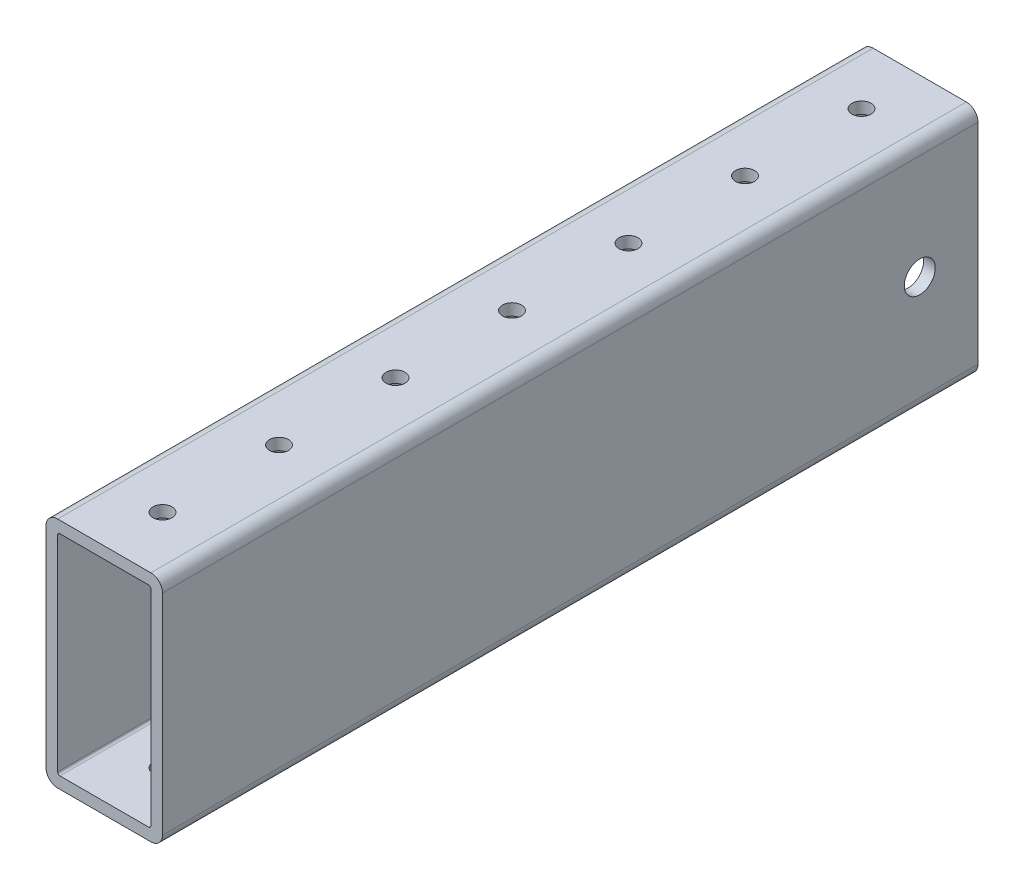
ISO-10303-21;
HEADER;
FILE_DESCRIPTION(('STEP AP214'),'2;1');
FILE_NAME('part.step','',(''),(''),'','','');
FILE_SCHEMA(('AUTOMOTIVE_DESIGN { 1 0 10303 214 1 1 1 1 }'));
ENDSEC;
DATA;
#1=APPLICATION_CONTEXT('core data for automotive mechanical design processes');
#2=APPLICATION_PROTOCOL_DEFINITION('international standard','automotive_design',2000,#1);
#3=PRODUCT_CONTEXT('',#1,'mechanical');
#4=PRODUCT('Part','Part','',(#3));
#5=PRODUCT_RELATED_PRODUCT_CATEGORY('part','',(#4));
#6=PRODUCT_DEFINITION_FORMATION('','',#4);
#7=PRODUCT_DEFINITION_CONTEXT('part definition',#1,'design');
#8=PRODUCT_DEFINITION('design','',#6,#7);
#9=PRODUCT_DEFINITION_SHAPE('','',#8);
#10=(LENGTH_UNIT() NAMED_UNIT(*) SI_UNIT(.MILLI.,.METRE.));
#11=(NAMED_UNIT(*) PLANE_ANGLE_UNIT() SI_UNIT($,.RADIAN.));
#12=(NAMED_UNIT(*) SI_UNIT($,.STERADIAN.) SOLID_ANGLE_UNIT());
#13=UNCERTAINTY_MEASURE_WITH_UNIT(LENGTH_MEASURE(1.E-05),#10,'distance_accuracy_value','');
#14=(GEOMETRIC_REPRESENTATION_CONTEXT(3) GLOBAL_UNCERTAINTY_ASSIGNED_CONTEXT((#13)) GLOBAL_UNIT_ASSIGNED_CONTEXT((#10,
#11,#12)) REPRESENTATION_CONTEXT('',''));
#15=CARTESIAN_POINT('',(0.,0.,0.));
#16=DIRECTION('',(0.,0.,1.));
#17=DIRECTION('',(1.,0.,0.));
#18=AXIS2_PLACEMENT_3D('',#15,#16,#17);
#19=CARTESIAN_POINT('',(-9.66000000000006,22.36,749.3));
#20=DIRECTION('',(0.,0.,1.));
#21=DIRECTION('',(1.,0.,0.));
#22=AXIS2_PLACEMENT_3D('',#19,#20,#21);
#23=CYLINDRICAL_SURFACE('',#22,0.5);
#24=DIRECTION('',(0.,0.,-1.));
#25=VECTOR('',#24,1.);
#26=CARTESIAN_POINT('',(-10.1600000000001,22.36,749.3));
#27=LINE('',#26,#25);
#28=CARTESIAN_POINT('',(-10.1600000000001,22.36,571.5));
#29=VERTEX_POINT('',#28);
#30=CARTESIAN_POINT('',(-10.1600000000001,22.36,749.3));
#31=VERTEX_POINT('',#30);
#32=EDGE_CURVE('E203',#29,#31,#27,.F.);
#33=ORIENTED_EDGE('',*,*,#32,.F.);
#34=CARTESIAN_POINT('',(-9.66000000000005,22.36,571.5));
#35=DIRECTION('',(0.,0.,1.));
#36=DIRECTION('',(1.,0.,0.));
#37=AXIS2_PLACEMENT_3D('',#34,#35,#36);
#38=CIRCLE('',#37,0.5);
#39=CARTESIAN_POINT('',(-9.66000000000006,22.86,571.5));
#40=VERTEX_POINT('',#39);
#41=EDGE_CURVE('E339',#29,#40,#38,.F.);
#42=ORIENTED_EDGE('',*,*,#41,.T.);
#43=DIRECTION('',(0.,0.,-1.));
#44=VECTOR('',#43,1.);
#45=CARTESIAN_POINT('',(-9.66000000000006,22.86,749.3));
#46=LINE('',#45,#44);
#47=CARTESIAN_POINT('',(-9.66000000000006,22.86,749.3));
#48=VERTEX_POINT('',#47);
#49=EDGE_CURVE('E279',#48,#40,#46,.T.);
#50=ORIENTED_EDGE('',*,*,#49,.F.);
#51=CARTESIAN_POINT('',(-9.66000000000006,22.36,749.3));
#52=DIRECTION('',(0.,0.,1.));
#53=DIRECTION('',(1.,0.,0.));
#54=AXIS2_PLACEMENT_3D('',#51,#52,#53);
#55=CIRCLE('',#54,0.5);
#56=EDGE_CURVE('E333',#31,#48,#55,.F.);
#57=ORIENTED_EDGE('',*,*,#56,.F.);
#58=EDGE_LOOP('',(#33,#42,#50,#57));
#59=FACE_BOUND('',#58,.T.);
#60=ADVANCED_FACE('F35',(#59),#23,.F.);
#61=CARTESIAN_POINT('',(0.,-25.4,584.2));
#62=DIRECTION('',(0.,1.,0.));
#63=DIRECTION('',(-1.,0.,0.));
#64=AXIS2_PLACEMENT_3D('',#61,#62,#63);
#65=CYLINDRICAL_SURFACE('',#64,2.07009999999996);
#66=CARTESIAN_POINT('',(0.,22.86,584.2));
#67=DIRECTION('',(0.,1.,0.));
#68=DIRECTION('',(-1.,0.,0.));
#69=AXIS2_PLACEMENT_3D('',#66,#67,#68);
#70=CIRCLE('',#69,2.07009999999996);
#71=CARTESIAN_POINT('',(-2.07009999999999,22.86,584.2));
#72=VERTEX_POINT('',#71);
#73=EDGE_CURVE('E276',#72,#72,#70,.T.);
#74=ORIENTED_EDGE('',*,*,#73,.F.);
#75=EDGE_LOOP('',(#74));
#76=FACE_BOUND('',#75,.T.);
#77=CARTESIAN_POINT('',(0.,25.4,584.2));
#78=DIRECTION('',(0.,1.,0.));
#79=DIRECTION('',(-1.,0.,0.));
#80=AXIS2_PLACEMENT_3D('',#77,#78,#79);
#81=CIRCLE('',#80,2.07009999999996);
#82=CARTESIAN_POINT('',(-2.07009999999999,25.4,584.2));
#83=VERTEX_POINT('',#82);
#84=EDGE_CURVE('E324',#83,#83,#81,.T.);
#85=ORIENTED_EDGE('',*,*,#84,.T.);
#86=EDGE_LOOP('',(#85));
#87=FACE_BOUND('',#86,.T.);
#88=ADVANCED_FACE('F522',(#76,#87),#65,.F.);
#89=CARTESIAN_POINT('',(0.,-25.4,609.6));
#90=DIRECTION('',(0.,1.,0.));
#91=DIRECTION('',(-1.,0.,0.));
#92=AXIS2_PLACEMENT_3D('',#89,#90,#91);
#93=CYLINDRICAL_SURFACE('',#92,2.07009999999996);
#94=CARTESIAN_POINT('',(0.,22.86,609.6));
#95=DIRECTION('',(0.,1.,0.));
#96=DIRECTION('',(-1.,0.,0.));
#97=AXIS2_PLACEMENT_3D('',#94,#95,#96);
#98=CIRCLE('',#97,2.07009999999996);
#99=CARTESIAN_POINT('',(-2.07009999999996,22.86,609.6));
#100=VERTEX_POINT('',#99);
#101=EDGE_CURVE('E273',#100,#100,#98,.T.);
#102=ORIENTED_EDGE('',*,*,#101,.F.);
#103=EDGE_LOOP('',(#102));
#104=FACE_BOUND('',#103,.T.);
#105=CARTESIAN_POINT('',(0.,25.4,609.6));
#106=DIRECTION('',(0.,1.,0.));
#107=DIRECTION('',(-1.,0.,0.));
#108=AXIS2_PLACEMENT_3D('',#105,#106,#107);
#109=CIRCLE('',#108,2.07009999999996);
#110=CARTESIAN_POINT('',(-2.07009999999996,25.4,609.6));
#111=VERTEX_POINT('',#110);
#112=EDGE_CURVE('E320',#111,#111,#109,.T.);
#113=ORIENTED_EDGE('',*,*,#112,.T.);
#114=EDGE_LOOP('',(#113));
#115=FACE_BOUND('',#114,.T.);
#116=ADVANCED_FACE('F519',(#104,#115),#93,.F.);
#117=CARTESIAN_POINT('',(0.,-25.4,635.));
#118=DIRECTION('',(0.,1.,0.));
#119=DIRECTION('',(-1.,0.,0.));
#120=AXIS2_PLACEMENT_3D('',#117,#118,#119);
#121=CYLINDRICAL_SURFACE('',#120,2.07009999999996);
#122=CARTESIAN_POINT('',(0.,22.8599999999999,635.));
#123=DIRECTION('',(0.,1.,0.));
#124=DIRECTION('',(-1.,0.,0.));
#125=AXIS2_PLACEMENT_3D('',#122,#123,#124);
#126=CIRCLE('',#125,2.07009999999996);
#127=CARTESIAN_POINT('',(-2.07009999999996,22.8599999999999,635.));
#128=VERTEX_POINT('',#127);
#129=EDGE_CURVE('E270',#128,#128,#126,.T.);
#130=ORIENTED_EDGE('',*,*,#129,.F.);
#131=EDGE_LOOP('',(#130));
#132=FACE_BOUND('',#131,.T.);
#133=CARTESIAN_POINT('',(0.,25.4,635.));
#134=DIRECTION('',(0.,1.,0.));
#135=DIRECTION('',(-1.,0.,0.));
#136=AXIS2_PLACEMENT_3D('',#133,#134,#135);
#137=CIRCLE('',#136,2.07009999999996);
#138=CARTESIAN_POINT('',(-2.07009999999996,25.4,635.));
#139=VERTEX_POINT('',#138);
#140=EDGE_CURVE('E317',#139,#139,#137,.T.);
#141=ORIENTED_EDGE('',*,*,#140,.T.);
#142=EDGE_LOOP('',(#141));
#143=FACE_BOUND('',#142,.T.);
#144=ADVANCED_FACE('F515',(#132,#143),#121,.F.);
#145=CARTESIAN_POINT('',(0.,-25.4,660.4));
#146=DIRECTION('',(0.,1.,0.));
#147=DIRECTION('',(-1.,0.,0.));
#148=AXIS2_PLACEMENT_3D('',#145,#146,#147);
#149=CYLINDRICAL_SURFACE('',#148,2.07009999999996);
#150=CARTESIAN_POINT('',(0.,22.86,660.4));
#151=DIRECTION('',(0.,1.,0.));
#152=DIRECTION('',(-1.,0.,0.));
#153=AXIS2_PLACEMENT_3D('',#150,#151,#152);
#154=CIRCLE('',#153,2.07009999999996);
#155=CARTESIAN_POINT('',(-2.07009999999996,22.86,660.4));
#156=VERTEX_POINT('',#155);
#157=EDGE_CURVE('E267',#156,#156,#154,.T.);
#158=ORIENTED_EDGE('',*,*,#157,.F.);
#159=EDGE_LOOP('',(#158));
#160=FACE_BOUND('',#159,.T.);
#161=CARTESIAN_POINT('',(0.,25.3999999999999,660.4));
#162=DIRECTION('',(0.,1.,0.));
#163=DIRECTION('',(-1.,0.,0.));
#164=AXIS2_PLACEMENT_3D('',#161,#162,#163);
#165=CIRCLE('',#164,2.07009999999996);
#166=CARTESIAN_POINT('',(-2.07009999999996,25.3999999999999,660.4));
#167=VERTEX_POINT('',#166);
#168=EDGE_CURVE('E314',#167,#167,#165,.T.);
#169=ORIENTED_EDGE('',*,*,#168,.T.);
#170=EDGE_LOOP('',(#169));
#171=FACE_BOUND('',#170,.T.);
#172=ADVANCED_FACE('F511',(#160,#171),#149,.F.);
#173=CARTESIAN_POINT('',(0.,-25.4,685.8));
#174=DIRECTION('',(0.,1.,0.));
#175=DIRECTION('',(-1.,0.,0.));
#176=AXIS2_PLACEMENT_3D('',#173,#174,#175);
#177=CYLINDRICAL_SURFACE('',#176,2.07009999999996);
#178=CARTESIAN_POINT('',(0.,22.86,685.8));
#179=DIRECTION('',(0.,1.,0.));
#180=DIRECTION('',(-1.,0.,0.));
#181=AXIS2_PLACEMENT_3D('',#178,#179,#180);
#182=CIRCLE('',#181,2.07009999999996);
#183=CARTESIAN_POINT('',(-2.07009999999999,22.86,685.8));
#184=VERTEX_POINT('',#183);
#185=EDGE_CURVE('E263',#184,#184,#182,.T.);
#186=ORIENTED_EDGE('',*,*,#185,.F.);
#187=EDGE_LOOP('',(#186));
#188=FACE_BOUND('',#187,.T.);
#189=CARTESIAN_POINT('',(0.,25.4,685.8));
#190=DIRECTION('',(0.,1.,0.));
#191=DIRECTION('',(-1.,0.,0.));
#192=AXIS2_PLACEMENT_3D('',#189,#190,#191);
#193=CIRCLE('',#192,2.07009999999996);
#194=CARTESIAN_POINT('',(-2.07009999999999,25.4,685.8));
#195=VERTEX_POINT('',#194);
#196=EDGE_CURVE('E311',#195,#195,#193,.T.);
#197=ORIENTED_EDGE('',*,*,#196,.T.);
#198=EDGE_LOOP('',(#197));
#199=FACE_BOUND('',#198,.T.);
#200=ADVANCED_FACE('F507',(#188,#199),#177,.F.);
#201=CARTESIAN_POINT('',(0.,-25.4,711.2));
#202=DIRECTION('',(0.,1.,0.));
#203=DIRECTION('',(-1.,0.,0.));
#204=AXIS2_PLACEMENT_3D('',#201,#202,#203);
#205=CYLINDRICAL_SURFACE('',#204,2.07009999999996);
#206=CARTESIAN_POINT('',(0.,22.86,711.2));
#207=DIRECTION('',(0.,1.,0.));
#208=DIRECTION('',(-1.,0.,0.));
#209=AXIS2_PLACEMENT_3D('',#206,#207,#208);
#210=CIRCLE('',#209,2.07009999999996);
#211=CARTESIAN_POINT('',(-2.07009999999996,22.86,711.2));
#212=VERTEX_POINT('',#211);
#213=EDGE_CURVE('E260',#212,#212,#210,.T.);
#214=ORIENTED_EDGE('',*,*,#213,.F.);
#215=EDGE_LOOP('',(#214));
#216=FACE_BOUND('',#215,.T.);
#217=CARTESIAN_POINT('',(0.,25.4,711.2));
#218=DIRECTION('',(0.,1.,0.));
#219=DIRECTION('',(-1.,0.,0.));
#220=AXIS2_PLACEMENT_3D('',#217,#218,#219);
#221=CIRCLE('',#220,2.07009999999996);
#222=CARTESIAN_POINT('',(-2.07009999999996,25.4,711.2));
#223=VERTEX_POINT('',#222);
#224=EDGE_CURVE('E308',#223,#223,#221,.T.);
#225=ORIENTED_EDGE('',*,*,#224,.T.);
#226=EDGE_LOOP('',(#225));
#227=FACE_BOUND('',#226,.T.);
#228=ADVANCED_FACE('F503',(#216,#227),#205,.F.);
#229=CARTESIAN_POINT('',(0.,-25.4,736.6));
#230=DIRECTION('',(0.,1.,0.));
#231=DIRECTION('',(-1.,0.,0.));
#232=AXIS2_PLACEMENT_3D('',#229,#230,#231);
#233=CYLINDRICAL_SURFACE('',#232,2.07009999999996);
#234=CARTESIAN_POINT('',(0.,22.86,736.6));
#235=DIRECTION('',(0.,1.,0.));
#236=DIRECTION('',(-1.,0.,0.));
#237=AXIS2_PLACEMENT_3D('',#234,#235,#236);
#238=CIRCLE('',#237,2.07009999999996);
#239=CARTESIAN_POINT('',(-2.07009999999993,22.86,736.6));
#240=VERTEX_POINT('',#239);
#241=EDGE_CURVE('E197',#240,#240,#238,.T.);
#242=ORIENTED_EDGE('',*,*,#241,.F.);
#243=EDGE_LOOP('',(#242));
#244=FACE_BOUND('',#243,.T.);
#245=CARTESIAN_POINT('',(0.,25.4,736.6));
#246=DIRECTION('',(0.,1.,0.));
#247=DIRECTION('',(-1.,0.,0.));
#248=AXIS2_PLACEMENT_3D('',#245,#246,#247);
#249=CIRCLE('',#248,2.07009999999996);
#250=CARTESIAN_POINT('',(-2.07009999999993,25.4,736.6));
#251=VERTEX_POINT('',#250);
#252=EDGE_CURVE('E305',#251,#251,#249,.T.);
#253=ORIENTED_EDGE('',*,*,#252,.T.);
#254=EDGE_LOOP('',(#253));
#255=FACE_BOUND('',#254,.T.);
#256=ADVANCED_FACE('F499',(#244,#255),#233,.F.);
#257=CARTESIAN_POINT('',(9.66,22.36,749.3));
#258=DIRECTION('',(0.,0.,1.));
#259=DIRECTION('',(1.,0.,0.));
#260=AXIS2_PLACEMENT_3D('',#257,#258,#259);
#261=CYLINDRICAL_SURFACE('',#260,0.5);
#262=DIRECTION('',(0.,0.,-1.));
#263=VECTOR('',#262,1.);
#264=CARTESIAN_POINT('',(9.66,22.86,749.3));
#265=LINE('',#264,#263);
#266=CARTESIAN_POINT('',(9.66,22.86,571.5));
#267=VERTEX_POINT('',#266);
#268=CARTESIAN_POINT('',(9.66,22.86,749.3));
#269=VERTEX_POINT('',#268);
#270=EDGE_CURVE('E202',#267,#269,#265,.F.);
#271=ORIENTED_EDGE('',*,*,#270,.F.);
#272=CARTESIAN_POINT('',(9.66000000000001,22.36,571.5));
#273=DIRECTION('',(0.,0.,1.));
#274=DIRECTION('',(1.,0.,0.));
#275=AXIS2_PLACEMENT_3D('',#272,#273,#274);
#276=CIRCLE('',#275,0.5);
#277=CARTESIAN_POINT('',(10.16,22.36,571.5));
#278=VERTEX_POINT('',#277);
#279=EDGE_CURVE('E343',#267,#278,#276,.F.);
#280=ORIENTED_EDGE('',*,*,#279,.T.);
#281=DIRECTION('',(0.,0.,1.));
#282=VECTOR('',#281,1.);
#283=CARTESIAN_POINT('',(10.16,22.36,749.3));
#284=LINE('',#283,#282);
#285=CARTESIAN_POINT('',(10.16,22.36,749.3));
#286=VERTEX_POINT('',#285);
#287=EDGE_CURVE('E193',#286,#278,#284,.F.);
#288=ORIENTED_EDGE('',*,*,#287,.F.);
#289=CARTESIAN_POINT('',(9.66,22.36,749.3));
#290=DIRECTION('',(0.,0.,1.));
#291=DIRECTION('',(1.,0.,0.));
#292=AXIS2_PLACEMENT_3D('',#289,#290,#291);
#293=CIRCLE('',#292,0.5);
#294=EDGE_CURVE('E332',#269,#286,#293,.F.);
#295=ORIENTED_EDGE('',*,*,#294,.F.);
#296=EDGE_LOOP('',(#271,#280,#288,#295));
#297=FACE_BOUND('',#296,.T.);
#298=ADVANCED_FACE('F496',(#297),#261,.F.);
#299=CARTESIAN_POINT('',(-9.66,-22.36,749.3));
#300=DIRECTION('',(0.,0.,1.));
#301=DIRECTION('',(1.,0.,0.));
#302=AXIS2_PLACEMENT_3D('',#299,#300,#301);
#303=CYLINDRICAL_SURFACE('',#302,0.5);
#304=DIRECTION('',(0.,0.,1.));
#305=VECTOR('',#304,1.);
#306=CARTESIAN_POINT('',(-9.66,-22.86,749.3));
#307=LINE('',#306,#305);
#308=CARTESIAN_POINT('',(-9.66,-22.86,571.5));
#309=VERTEX_POINT('',#308);
#310=CARTESIAN_POINT('',(-9.66,-22.86,749.3));
#311=VERTEX_POINT('',#310);
#312=EDGE_CURVE('E199',#309,#311,#307,.T.);
#313=ORIENTED_EDGE('',*,*,#312,.F.);
#314=CARTESIAN_POINT('',(-9.65999999999999,-22.36,571.5));
#315=DIRECTION('',(0.,0.,1.));
#316=DIRECTION('',(1.,0.,0.));
#317=AXIS2_PLACEMENT_3D('',#314,#315,#316);
#318=CIRCLE('',#317,0.5);
#319=CARTESIAN_POINT('',(-10.1600000000001,-22.36,571.5));
#320=VERTEX_POINT('',#319);
#321=EDGE_CURVE('E57',#309,#320,#318,.F.);
#322=ORIENTED_EDGE('',*,*,#321,.T.);
#323=DIRECTION('',(0.,0.,-1.));
#324=VECTOR('',#323,1.);
#325=CARTESIAN_POINT('',(-10.1600000000001,-22.36,749.3));
#326=LINE('',#325,#324);
#327=CARTESIAN_POINT('',(-10.1600000000001,-22.36,749.3));
#328=VERTEX_POINT('',#327);
#329=EDGE_CURVE('E200',#328,#320,#326,.T.);
#330=ORIENTED_EDGE('',*,*,#329,.F.);
#331=CARTESIAN_POINT('',(-9.66,-22.36,749.3));
#332=DIRECTION('',(0.,0.,1.));
#333=DIRECTION('',(1.,0.,0.));
#334=AXIS2_PLACEMENT_3D('',#331,#332,#333);
#335=CIRCLE('',#334,0.5);
#336=EDGE_CURVE('E330',#311,#328,#335,.F.);
#337=ORIENTED_EDGE('',*,*,#336,.F.);
#338=EDGE_LOOP('',(#313,#322,#330,#337));
#339=FACE_BOUND('',#338,.T.);
#340=ADVANCED_FACE('F488',(#339),#303,.F.);
#341=CARTESIAN_POINT('',(9.66,-22.36,749.3));
#342=DIRECTION('',(0.,0.,1.));
#343=DIRECTION('',(1.,0.,0.));
#344=AXIS2_PLACEMENT_3D('',#341,#342,#343);
#345=CYLINDRICAL_SURFACE('',#344,0.5);
#346=DIRECTION('',(0.,0.,1.));
#347=VECTOR('',#346,1.);
#348=CARTESIAN_POINT('',(10.16,-22.36,749.3));
#349=LINE('',#348,#347);
#350=CARTESIAN_POINT('',(10.16,-22.36,571.5));
#351=VERTEX_POINT('',#350);
#352=CARTESIAN_POINT('',(10.16,-22.36,749.3));
#353=VERTEX_POINT('',#352);
#354=EDGE_CURVE('E196',#351,#353,#349,.T.);
#355=ORIENTED_EDGE('',*,*,#354,.F.);
#356=CARTESIAN_POINT('',(9.66000000000001,-22.36,571.5));
#357=DIRECTION('',(0.,0.,1.));
#358=DIRECTION('',(1.,0.,0.));
#359=AXIS2_PLACEMENT_3D('',#356,#357,#358);
#360=CIRCLE('',#359,0.5);
#361=CARTESIAN_POINT('',(9.66000000000004,-22.86,571.5));
#362=VERTEX_POINT('',#361);
#363=EDGE_CURVE('E352',#351,#362,#360,.F.);
#364=ORIENTED_EDGE('',*,*,#363,.T.);
#365=DIRECTION('',(0.,0.,1.));
#366=VECTOR('',#365,1.);
#367=CARTESIAN_POINT('',(9.66,-22.86,749.3));
#368=LINE('',#367,#366);
#369=CARTESIAN_POINT('',(9.66,-22.86,749.3));
#370=VERTEX_POINT('',#369);
#371=EDGE_CURVE('E255',#370,#362,#368,.F.);
#372=ORIENTED_EDGE('',*,*,#371,.F.);
#373=CARTESIAN_POINT('',(9.66,-22.36,749.3));
#374=DIRECTION('',(0.,0.,1.));
#375=DIRECTION('',(1.,0.,0.));
#376=AXIS2_PLACEMENT_3D('',#373,#374,#375);
#377=CIRCLE('',#376,0.5);
#378=EDGE_CURVE('E214',#353,#370,#377,.F.);
#379=ORIENTED_EDGE('',*,*,#378,.F.);
#380=EDGE_LOOP('',(#355,#364,#372,#379));
#381=FACE_BOUND('',#380,.T.);
#382=ADVANCED_FACE('F478',(#381),#345,.F.);
#383=CARTESIAN_POINT('',(0.,-25.4,584.2));
#384=DIRECTION('',(0.,1.,0.));
#385=DIRECTION('',(-1.,0.,0.));
#386=AXIS2_PLACEMENT_3D('',#383,#384,#385);
#387=CYLINDRICAL_SURFACE('',#386,2.07009999999996);
#388=CARTESIAN_POINT('',(0.,-22.86,584.2));
#389=DIRECTION('',(0.,1.,0.));
#390=DIRECTION('',(-1.,0.,0.));
#391=AXIS2_PLACEMENT_3D('',#388,#389,#390);
#392=CIRCLE('',#391,2.07009999999996);
#393=CARTESIAN_POINT('',(-2.07009999999999,-22.86,584.2));
#394=VERTEX_POINT('',#393);
#395=EDGE_CURVE('E252',#394,#394,#392,.F.);
#396=ORIENTED_EDGE('',*,*,#395,.F.);
#397=EDGE_LOOP('',(#396));
#398=FACE_BOUND('',#397,.T.);
#399=CARTESIAN_POINT('',(0.,-25.4,584.2));
#400=DIRECTION('',(0.,1.,0.));
#401=DIRECTION('',(-1.,0.,0.));
#402=AXIS2_PLACEMENT_3D('',#399,#400,#401);
#403=CIRCLE('',#402,2.07009999999996);
#404=CARTESIAN_POINT('',(-2.07009999999999,-25.4,584.2));
#405=VERTEX_POINT('',#404);
#406=EDGE_CURVE('E302',#405,#405,#403,.F.);
#407=ORIENTED_EDGE('',*,*,#406,.T.);
#408=EDGE_LOOP('',(#407));
#409=FACE_BOUND('',#408,.T.);
#410=ADVANCED_FACE('F475',(#398,#409),#387,.F.);
#411=CARTESIAN_POINT('',(0.,-25.4,609.6));
#412=DIRECTION('',(0.,1.,0.));
#413=DIRECTION('',(-1.,0.,0.));
#414=AXIS2_PLACEMENT_3D('',#411,#412,#413);
#415=CYLINDRICAL_SURFACE('',#414,2.07009999999996);
#416=CARTESIAN_POINT('',(0.,-22.86,609.6));
#417=DIRECTION('',(0.,1.,0.));
#418=DIRECTION('',(-1.,0.,0.));
#419=AXIS2_PLACEMENT_3D('',#416,#417,#418);
#420=CIRCLE('',#419,2.07009999999996);
#421=CARTESIAN_POINT('',(-2.07009999999996,-22.86,609.6));
#422=VERTEX_POINT('',#421);
#423=EDGE_CURVE('E249',#422,#422,#420,.F.);
#424=ORIENTED_EDGE('',*,*,#423,.F.);
#425=EDGE_LOOP('',(#424));
#426=FACE_BOUND('',#425,.T.);
#427=CARTESIAN_POINT('',(0.,-25.4,609.6));
#428=DIRECTION('',(0.,1.,0.));
#429=DIRECTION('',(-1.,0.,0.));
#430=AXIS2_PLACEMENT_3D('',#427,#428,#429);
#431=CIRCLE('',#430,2.07009999999996);
#432=CARTESIAN_POINT('',(-2.07009999999996,-25.4,609.6));
#433=VERTEX_POINT('',#432);
#434=EDGE_CURVE('E299',#433,#433,#431,.F.);
#435=ORIENTED_EDGE('',*,*,#434,.T.);
#436=EDGE_LOOP('',(#435));
#437=FACE_BOUND('',#436,.T.);
#438=ADVANCED_FACE('F477',(#426,#437),#415,.F.);
#439=CARTESIAN_POINT('',(0.,-25.4,635.));
#440=DIRECTION('',(0.,1.,0.));
#441=DIRECTION('',(-1.,0.,0.));
#442=AXIS2_PLACEMENT_3D('',#439,#440,#441);
#443=CYLINDRICAL_SURFACE('',#442,2.07009999999996);
#444=CARTESIAN_POINT('',(0.,-22.86,635.));
#445=DIRECTION('',(0.,1.,0.));
#446=DIRECTION('',(-1.,0.,0.));
#447=AXIS2_PLACEMENT_3D('',#444,#445,#446);
#448=CIRCLE('',#447,2.07009999999996);
#449=CARTESIAN_POINT('',(-2.07009999999996,-22.86,635.));
#450=VERTEX_POINT('',#449);
#451=EDGE_CURVE('E246',#450,#450,#448,.F.);
#452=ORIENTED_EDGE('',*,*,#451,.F.);
#453=EDGE_LOOP('',(#452));
#454=FACE_BOUND('',#453,.T.);
#455=CARTESIAN_POINT('',(0.,-25.4,635.));
#456=DIRECTION('',(0.,1.,0.));
#457=DIRECTION('',(-1.,0.,0.));
#458=AXIS2_PLACEMENT_3D('',#455,#456,#457);
#459=CIRCLE('',#458,2.07009999999996);
#460=CARTESIAN_POINT('',(-2.07009999999996,-25.4,635.));
#461=VERTEX_POINT('',#460);
#462=EDGE_CURVE('E296',#461,#461,#459,.F.);
#463=ORIENTED_EDGE('',*,*,#462,.T.);
#464=EDGE_LOOP('',(#463));
#465=FACE_BOUND('',#464,.T.);
#466=ADVANCED_FACE('F485',(#454,#465),#443,.F.);
#467=CARTESIAN_POINT('',(0.,-25.4,660.4));
#468=DIRECTION('',(0.,1.,0.));
#469=DIRECTION('',(-1.,0.,0.));
#470=AXIS2_PLACEMENT_3D('',#467,#468,#469);
#471=CYLINDRICAL_SURFACE('',#470,2.07009999999996);
#472=CARTESIAN_POINT('',(0.,-22.86,660.4));
#473=DIRECTION('',(0.,1.,0.));
#474=DIRECTION('',(-1.,0.,0.));
#475=AXIS2_PLACEMENT_3D('',#472,#473,#474);
#476=CIRCLE('',#475,2.07009999999996);
#477=CARTESIAN_POINT('',(-2.07009999999996,-22.86,660.4));
#478=VERTEX_POINT('',#477);
#479=EDGE_CURVE('E243',#478,#478,#476,.F.);
#480=ORIENTED_EDGE('',*,*,#479,.F.);
#481=EDGE_LOOP('',(#480));
#482=FACE_BOUND('',#481,.T.);
#483=CARTESIAN_POINT('',(0.,-25.4,660.4));
#484=DIRECTION('',(0.,1.,0.));
#485=DIRECTION('',(-1.,0.,0.));
#486=AXIS2_PLACEMENT_3D('',#483,#484,#485);
#487=CIRCLE('',#486,2.07009999999996);
#488=CARTESIAN_POINT('',(-2.07009999999996,-25.4,660.4));
#489=VERTEX_POINT('',#488);
#490=EDGE_CURVE('E293',#489,#489,#487,.F.);
#491=ORIENTED_EDGE('',*,*,#490,.T.);
#492=EDGE_LOOP('',(#491));
#493=FACE_BOUND('',#492,.T.);
#494=ADVANCED_FACE('F596',(#482,#493),#471,.F.);
#495=CARTESIAN_POINT('',(0.,-25.4,685.8));
#496=DIRECTION('',(0.,1.,0.));
#497=DIRECTION('',(-1.,0.,0.));
#498=AXIS2_PLACEMENT_3D('',#495,#496,#497);
#499=CYLINDRICAL_SURFACE('',#498,2.07009999999996);
#500=CARTESIAN_POINT('',(0.,-22.86,685.8));
#501=DIRECTION('',(0.,1.,0.));
#502=DIRECTION('',(-1.,0.,0.));
#503=AXIS2_PLACEMENT_3D('',#500,#501,#502);
#504=CIRCLE('',#503,2.07009999999996);
#505=CARTESIAN_POINT('',(-2.07009999999999,-22.86,685.8));
#506=VERTEX_POINT('',#505);
#507=EDGE_CURVE('E240',#506,#506,#504,.F.);
#508=ORIENTED_EDGE('',*,*,#507,.F.);
#509=EDGE_LOOP('',(#508));
#510=FACE_BOUND('',#509,.T.);
#511=CARTESIAN_POINT('',(0.,-25.4,685.8));
#512=DIRECTION('',(0.,1.,0.));
#513=DIRECTION('',(-1.,0.,0.));
#514=AXIS2_PLACEMENT_3D('',#511,#512,#513);
#515=CIRCLE('',#514,2.07009999999996);
#516=CARTESIAN_POINT('',(-2.07009999999999,-25.4,685.8));
#517=VERTEX_POINT('',#516);
#518=EDGE_CURVE('E290',#517,#517,#515,.F.);
#519=ORIENTED_EDGE('',*,*,#518,.T.);
#520=EDGE_LOOP('',(#519));
#521=FACE_BOUND('',#520,.T.);
#522=ADVANCED_FACE('F600',(#510,#521),#499,.F.);
#523=CARTESIAN_POINT('',(0.,-25.4,711.2));
#524=DIRECTION('',(0.,1.,0.));
#525=DIRECTION('',(-1.,0.,0.));
#526=AXIS2_PLACEMENT_3D('',#523,#524,#525);
#527=CYLINDRICAL_SURFACE('',#526,2.07009999999996);
#528=CARTESIAN_POINT('',(0.,-22.86,711.2));
#529=DIRECTION('',(0.,1.,0.));
#530=DIRECTION('',(-1.,0.,0.));
#531=AXIS2_PLACEMENT_3D('',#528,#529,#530);
#532=CIRCLE('',#531,2.07009999999996);
#533=CARTESIAN_POINT('',(-2.07009999999996,-22.86,711.2));
#534=VERTEX_POINT('',#533);
#535=EDGE_CURVE('E237',#534,#534,#532,.F.);
#536=ORIENTED_EDGE('',*,*,#535,.F.);
#537=EDGE_LOOP('',(#536));
#538=FACE_BOUND('',#537,.T.);
#539=CARTESIAN_POINT('',(0.,-25.4,711.2));
#540=DIRECTION('',(0.,1.,0.));
#541=DIRECTION('',(-1.,0.,0.));
#542=AXIS2_PLACEMENT_3D('',#539,#540,#541);
#543=CIRCLE('',#542,2.07009999999996);
#544=CARTESIAN_POINT('',(-2.07009999999996,-25.4,711.2));
#545=VERTEX_POINT('',#544);
#546=EDGE_CURVE('E287',#545,#545,#543,.F.);
#547=ORIENTED_EDGE('',*,*,#546,.T.);
#548=EDGE_LOOP('',(#547));
#549=FACE_BOUND('',#548,.T.);
#550=ADVANCED_FACE('F606',(#538,#549),#527,.F.);
#551=CARTESIAN_POINT('',(0.,-25.4,736.6));
#552=DIRECTION('',(0.,1.,0.));
#553=DIRECTION('',(-1.,0.,0.));
#554=AXIS2_PLACEMENT_3D('',#551,#552,#553);
#555=CYLINDRICAL_SURFACE('',#554,2.07009999999996);
#556=CARTESIAN_POINT('',(0.,-22.86,736.6));
#557=DIRECTION('',(0.,1.,0.));
#558=DIRECTION('',(-1.,0.,0.));
#559=AXIS2_PLACEMENT_3D('',#556,#557,#558);
#560=CIRCLE('',#559,2.07009999999996);
#561=CARTESIAN_POINT('',(-2.07009999999994,-22.86,736.6));
#562=VERTEX_POINT('',#561);
#563=EDGE_CURVE('E234',#562,#562,#560,.F.);
#564=ORIENTED_EDGE('',*,*,#563,.F.);
#565=EDGE_LOOP('',(#564));
#566=FACE_BOUND('',#565,.T.);
#567=CARTESIAN_POINT('',(0.,-25.4,736.6));
#568=DIRECTION('',(0.,1.,0.));
#569=DIRECTION('',(-1.,0.,0.));
#570=AXIS2_PLACEMENT_3D('',#567,#568,#569);
#571=CIRCLE('',#570,2.07009999999996);
#572=CARTESIAN_POINT('',(-2.07009999999994,-25.4,736.6));
#573=VERTEX_POINT('',#572);
#574=EDGE_CURVE('E209',#573,#573,#571,.F.);
#575=ORIENTED_EDGE('',*,*,#574,.T.);
#576=EDGE_LOOP('',(#575));
#577=FACE_BOUND('',#576,.T.);
#578=ADVANCED_FACE('F391',(#566,#577),#555,.F.);
#579=CARTESIAN_POINT('',(12.7,-22.86,749.3));
#580=DIRECTION('',(-1.,0.,0.));
#581=DIRECTION('',(0.,0.,1.));
#582=AXIS2_PLACEMENT_3D('',#579,#580,#581);
#583=PLANE('',#582);
#584=CARTESIAN_POINT('',(12.7,0.,584.2));
#585=DIRECTION('',(1.,0.,0.));
#586=DIRECTION('',(0.,0.,-1.));
#587=AXIS2_PLACEMENT_3D('',#584,#585,#586);
#588=CIRCLE('',#587,3.3782);
#589=CARTESIAN_POINT('',(12.7,0.,580.8218));
#590=VERTEX_POINT('',#589);
#591=EDGE_CURVE('E381',#590,#590,#588,.T.);
#592=ORIENTED_EDGE('',*,*,#591,.F.);
#593=EDGE_LOOP('',(#592));
#594=FACE_BOUND('',#593,.T.);
#595=DIRECTION('',(0.,0.,-1.));
#596=VECTOR('',#595,1.);
#597=CARTESIAN_POINT('',(12.7,-22.8599999999999,749.3));
#598=LINE('',#597,#596);
#599=CARTESIAN_POINT('',(12.7,-22.86,571.5));
#600=VERTEX_POINT('',#599);
#601=CARTESIAN_POINT('',(12.7,-22.86,749.3));
#602=VERTEX_POINT('',#601);
#603=EDGE_CURVE('E206',#600,#602,#598,.F.);
#604=ORIENTED_EDGE('',*,*,#603,.F.);
#605=DIRECTION('',(0.,1.,0.));
#606=VECTOR('',#605,1.);
#607=CARTESIAN_POINT('',(12.7,-22.86,571.5));
#608=LINE('',#607,#606);
#609=CARTESIAN_POINT('',(12.7,22.86,571.5));
#610=VERTEX_POINT('',#609);
#611=EDGE_CURVE('E361',#600,#610,#608,.T.);
#612=ORIENTED_EDGE('',*,*,#611,.T.);
#613=DIRECTION('',(0.,0.,-1.));
#614=VECTOR('',#613,1.);
#615=CARTESIAN_POINT('',(12.7,22.86,749.3));
#616=LINE('',#615,#614);
#617=CARTESIAN_POINT('',(12.7,22.86,749.3));
#618=VERTEX_POINT('',#617);
#619=EDGE_CURVE('E210',#618,#610,#616,.T.);
#620=ORIENTED_EDGE('',*,*,#619,.F.);
#621=DIRECTION('',(0.,1.,0.));
#622=VECTOR('',#621,1.);
#623=CARTESIAN_POINT('',(12.7,-22.86,749.3));
#624=LINE('',#623,#622);
#625=EDGE_CURVE('E188',#602,#618,#624,.T.);
#626=ORIENTED_EDGE('',*,*,#625,.F.);
#627=EDGE_LOOP('',(#604,#612,#620,#626));
#628=FACE_BOUND('',#627,.T.);
#629=ADVANCED_FACE('F387',(#594,#628),#583,.F.);
#630=CARTESIAN_POINT('',(10.16,22.86,749.3));
#631=DIRECTION('',(0.,0.,-1.));
#632=DIRECTION('',(-1.,0.,0.));
#633=AXIS2_PLACEMENT_3D('',#630,#631,#632);
#634=CYLINDRICAL_SURFACE('',#633,2.54);
#635=CARTESIAN_POINT('',(10.16,22.86,571.5));
#636=DIRECTION('',(0.,0.,1.));
#637=DIRECTION('',(1.,0.,0.));
#638=AXIS2_PLACEMENT_3D('',#635,#636,#637);
#639=CIRCLE('',#638,2.54);
#640=CARTESIAN_POINT('',(10.16,25.4,571.5));
#641=VERTEX_POINT('',#640);
#642=EDGE_CURVE('E365',#641,#610,#639,.F.);
#643=ORIENTED_EDGE('',*,*,#642,.F.);
#644=DIRECTION('',(0.,0.,-1.));
#645=VECTOR('',#644,1.);
#646=CARTESIAN_POINT('',(10.1600000000001,25.4,749.3));
#647=LINE('',#646,#645);
#648=CARTESIAN_POINT('',(10.16,25.4,749.3));
#649=VERTEX_POINT('',#648);
#650=EDGE_CURVE('E213',#641,#649,#647,.F.);
#651=ORIENTED_EDGE('',*,*,#650,.T.);
#652=CARTESIAN_POINT('',(10.16,22.86,749.3));
#653=DIRECTION('',(0.,0.,-1.));
#654=DIRECTION('',(-1.,0.,0.));
#655=AXIS2_PLACEMENT_3D('',#652,#653,#654);
#656=CIRCLE('',#655,2.54);
#657=EDGE_CURVE('E191',#618,#649,#656,.F.);
#658=ORIENTED_EDGE('',*,*,#657,.F.);
#659=ORIENTED_EDGE('',*,*,#619,.T.);
#660=EDGE_LOOP('',(#643,#651,#658,#659));
#661=FACE_BOUND('',#660,.T.);
#662=ADVANCED_FACE('F390',(#661),#634,.T.);
#663=CARTESIAN_POINT('',(-10.1600000000001,25.4,749.3));
#664=DIRECTION('',(0.,-1.,0.));
#665=DIRECTION('',(0.,0.,-1.));
#666=AXIS2_PLACEMENT_3D('',#663,#664,#665);
#667=PLANE('',#666);
#668=ORIENTED_EDGE('',*,*,#252,.F.);
#669=EDGE_LOOP('',(#668));
#670=FACE_BOUND('',#669,.T.);
#671=ORIENTED_EDGE('',*,*,#224,.F.);
#672=EDGE_LOOP('',(#671));
#673=FACE_BOUND('',#672,.T.);
#674=ORIENTED_EDGE('',*,*,#196,.F.);
#675=EDGE_LOOP('',(#674));
#676=FACE_BOUND('',#675,.T.);
#677=ORIENTED_EDGE('',*,*,#168,.F.);
#678=EDGE_LOOP('',(#677));
#679=FACE_BOUND('',#678,.T.);
#680=ORIENTED_EDGE('',*,*,#140,.F.);
#681=EDGE_LOOP('',(#680));
#682=FACE_BOUND('',#681,.T.);
#683=ORIENTED_EDGE('',*,*,#112,.F.);
#684=EDGE_LOOP('',(#683));
#685=FACE_BOUND('',#684,.T.);
#686=ORIENTED_EDGE('',*,*,#84,.F.);
#687=EDGE_LOOP('',(#686));
#688=FACE_BOUND('',#687,.T.);
#689=ORIENTED_EDGE('',*,*,#650,.F.);
#690=DIRECTION('',(-1.,0.,0.));
#691=VECTOR('',#690,1.);
#692=CARTESIAN_POINT('',(-10.1600000000001,25.4,571.5));
#693=LINE('',#692,#691);
#694=CARTESIAN_POINT('',(-10.1600000000001,25.4,571.5));
#695=VERTEX_POINT('',#694);
#696=EDGE_CURVE('E367',#641,#695,#693,.T.);
#697=ORIENTED_EDGE('',*,*,#696,.T.);
#698=DIRECTION('',(0.,0.,-1.));
#699=VECTOR('',#698,1.);
#700=CARTESIAN_POINT('',(-10.1600000000001,25.4,749.3));
#701=LINE('',#700,#699);
#702=CARTESIAN_POINT('',(-10.1600000000001,25.4,749.3));
#703=VERTEX_POINT('',#702);
#704=EDGE_CURVE('E164',#703,#695,#701,.T.);
#705=ORIENTED_EDGE('',*,*,#704,.F.);
#706=DIRECTION('',(1.,0.,0.));
#707=VECTOR('',#706,1.);
#708=CARTESIAN_POINT('',(10.16,25.4,749.3));
#709=LINE('',#708,#707);
#710=EDGE_CURVE('E226',#649,#703,#709,.F.);
#711=ORIENTED_EDGE('',*,*,#710,.F.);
#712=EDGE_LOOP('',(#689,#697,#705,#711));
#713=FACE_BOUND('',#712,.T.);
#714=ADVANCED_FACE('F413',(#670,#673,#676,#679,#682,#685,#688,#713),#667,.F.);
#715=CARTESIAN_POINT('',(-10.1600000000001,-25.4,749.3));
#716=DIRECTION('',(0.,1.,0.));
#717=DIRECTION('',(0.,0.,1.));
#718=AXIS2_PLACEMENT_3D('',#715,#716,#717);
#719=PLANE('',#718);
#720=ORIENTED_EDGE('',*,*,#574,.F.);
#721=EDGE_LOOP('',(#720));
#722=FACE_BOUND('',#721,.T.);
#723=ORIENTED_EDGE('',*,*,#546,.F.);
#724=EDGE_LOOP('',(#723));
#725=FACE_BOUND('',#724,.T.);
#726=ORIENTED_EDGE('',*,*,#518,.F.);
#727=EDGE_LOOP('',(#726));
#728=FACE_BOUND('',#727,.T.);
#729=ORIENTED_EDGE('',*,*,#490,.F.);
#730=EDGE_LOOP('',(#729));
#731=FACE_BOUND('',#730,.T.);
#732=ORIENTED_EDGE('',*,*,#462,.F.);
#733=EDGE_LOOP('',(#732));
#734=FACE_BOUND('',#733,.T.);
#735=ORIENTED_EDGE('',*,*,#434,.F.);
#736=EDGE_LOOP('',(#735));
#737=FACE_BOUND('',#736,.T.);
#738=ORIENTED_EDGE('',*,*,#406,.F.);
#739=EDGE_LOOP('',(#738));
#740=FACE_BOUND('',#739,.T.);
#741=DIRECTION('',(0.,0.,-1.));
#742=VECTOR('',#741,1.);
#743=CARTESIAN_POINT('',(-10.1599999999999,-25.4,749.3));
#744=LINE('',#743,#742);
#745=CARTESIAN_POINT('',(-10.16,-25.4,571.5));
#746=VERTEX_POINT('',#745);
#747=CARTESIAN_POINT('',(-10.16,-25.4,749.3));
#748=VERTEX_POINT('',#747);
#749=EDGE_CURVE('E174',#746,#748,#744,.F.);
#750=ORIENTED_EDGE('',*,*,#749,.F.);
#751=DIRECTION('',(1.,0.,0.));
#752=VECTOR('',#751,1.);
#753=CARTESIAN_POINT('',(-10.1600000000001,-25.4,571.5));
#754=LINE('',#753,#752);
#755=CARTESIAN_POINT('',(10.16,-25.4,571.5));
#756=VERTEX_POINT('',#755);
#757=EDGE_CURVE('E165',#746,#756,#754,.T.);
#758=ORIENTED_EDGE('',*,*,#757,.T.);
#759=DIRECTION('',(0.,0.,-1.));
#760=VECTOR('',#759,1.);
#761=CARTESIAN_POINT('',(10.16,-25.4,749.3));
#762=LINE('',#761,#760);
#763=CARTESIAN_POINT('',(10.16,-25.4,749.3));
#764=VERTEX_POINT('',#763);
#765=EDGE_CURVE('E205',#764,#756,#762,.T.);
#766=ORIENTED_EDGE('',*,*,#765,.F.);
#767=DIRECTION('',(1.,0.,0.));
#768=VECTOR('',#767,1.);
#769=CARTESIAN_POINT('',(10.16,-25.4,749.3));
#770=LINE('',#769,#768);
#771=EDGE_CURVE('E221',#748,#764,#770,.T.);
#772=ORIENTED_EDGE('',*,*,#771,.F.);
#773=EDGE_LOOP('',(#750,#758,#766,#772));
#774=FACE_BOUND('',#773,.T.);
#775=ADVANCED_FACE('F406',(#722,#725,#728,#731,#734,#737,#740,#774),#719,.F.);
#776=CARTESIAN_POINT('',(10.16,-22.86,749.3));
#777=DIRECTION('',(0.,0.,-1.));
#778=DIRECTION('',(-1.,0.,0.));
#779=AXIS2_PLACEMENT_3D('',#776,#777,#778);
#780=CYLINDRICAL_SURFACE('',#779,2.54);
#781=CARTESIAN_POINT('',(10.16,-22.86,571.5));
#782=DIRECTION('',(0.,0.,1.));
#783=DIRECTION('',(1.,0.,0.));
#784=AXIS2_PLACEMENT_3D('',#781,#782,#783);
#785=CIRCLE('',#784,2.54);
#786=EDGE_CURVE('E358',#600,#756,#785,.F.);
#787=ORIENTED_EDGE('',*,*,#786,.F.);
#788=ORIENTED_EDGE('',*,*,#603,.T.);
#789=CARTESIAN_POINT('',(10.16,-22.86,749.3));
#790=DIRECTION('',(0.,0.,-1.));
#791=DIRECTION('',(-1.,0.,0.));
#792=AXIS2_PLACEMENT_3D('',#789,#790,#791);
#793=CIRCLE('',#792,2.54);
#794=EDGE_CURVE('E192',#764,#602,#793,.F.);
#795=ORIENTED_EDGE('',*,*,#794,.F.);
#796=ORIENTED_EDGE('',*,*,#765,.T.);
#797=EDGE_LOOP('',(#787,#788,#795,#796));
#798=FACE_BOUND('',#797,.T.);
#799=ADVANCED_FACE('F399',(#798),#780,.T.);
#800=CARTESIAN_POINT('',(-10.1600000000001,-22.86,749.3));
#801=DIRECTION('',(1.,0.,0.));
#802=DIRECTION('',(0.,0.,-1.));
#803=AXIS2_PLACEMENT_3D('',#800,#801,#802);
#804=PLANE('',#803);
#805=CARTESIAN_POINT('',(-10.1600000000001,0.,584.2));
#806=DIRECTION('',(1.,0.,0.));
#807=DIRECTION('',(0.,0.,-1.));
#808=AXIS2_PLACEMENT_3D('',#805,#806,#807);
#809=CIRCLE('',#808,3.3782);
#810=CARTESIAN_POINT('',(-10.1600000000001,0.,580.8218));
#811=VERTEX_POINT('',#810);
#812=EDGE_CURVE('E372',#811,#811,#809,.T.);
#813=ORIENTED_EDGE('',*,*,#812,.F.);
#814=EDGE_LOOP('',(#813));
#815=FACE_BOUND('',#814,.T.);
#816=DIRECTION('',(0.,-1.,0.));
#817=VECTOR('',#816,1.);
#818=CARTESIAN_POINT('',(-10.1600000000001,-22.86,571.5));
#819=LINE('',#818,#817);
#820=EDGE_CURVE('E49',#29,#320,#819,.T.);
#821=ORIENTED_EDGE('',*,*,#820,.F.);
#822=ORIENTED_EDGE('',*,*,#32,.T.);
#823=DIRECTION('',(0.,1.,0.));
#824=VECTOR('',#823,1.);
#825=CARTESIAN_POINT('',(-10.1600000000001,-22.86,749.3));
#826=LINE('',#825,#824);
#827=EDGE_CURVE('E179',#328,#31,#826,.T.);
#828=ORIENTED_EDGE('',*,*,#827,.F.);
#829=ORIENTED_EDGE('',*,*,#329,.T.);
#830=EDGE_LOOP('',(#821,#822,#828,#829));
#831=FACE_BOUND('',#830,.T.);
#832=ADVANCED_FACE('F450',(#815,#831),#804,.T.);
#833=CARTESIAN_POINT('',(-10.1600000000001,22.86,749.3));
#834=DIRECTION('',(0.,-1.,0.));
#835=DIRECTION('',(0.,0.,-1.));
#836=AXIS2_PLACEMENT_3D('',#833,#834,#835);
#837=PLANE('',#836);
#838=DIRECTION('',(-1.,0.,0.));
#839=VECTOR('',#838,1.);
#840=CARTESIAN_POINT('',(-10.1600000000001,22.86,571.5));
#841=LINE('',#840,#839);
#842=EDGE_CURVE('E334',#267,#40,#841,.T.);
#843=ORIENTED_EDGE('',*,*,#842,.F.);
#844=ORIENTED_EDGE('',*,*,#270,.T.);
#845=DIRECTION('',(1.,0.,0.));
#846=VECTOR('',#845,1.);
#847=CARTESIAN_POINT('',(10.16,22.86,749.3));
#848=LINE('',#847,#846);
#849=EDGE_CURVE('E187',#48,#269,#848,.T.);
#850=ORIENTED_EDGE('',*,*,#849,.F.);
#851=ORIENTED_EDGE('',*,*,#49,.T.);
#852=EDGE_LOOP('',(#843,#844,#850,#851));
#853=FACE_BOUND('',#852,.T.);
#854=ORIENTED_EDGE('',*,*,#241,.T.);
#855=EDGE_LOOP('',(#854));
#856=FACE_BOUND('',#855,.T.);
#857=ORIENTED_EDGE('',*,*,#213,.T.);
#858=EDGE_LOOP('',(#857));
#859=FACE_BOUND('',#858,.T.);
#860=ORIENTED_EDGE('',*,*,#185,.T.);
#861=EDGE_LOOP('',(#860));
#862=FACE_BOUND('',#861,.T.);
#863=ORIENTED_EDGE('',*,*,#157,.T.);
#864=EDGE_LOOP('',(#863));
#865=FACE_BOUND('',#864,.T.);
#866=ORIENTED_EDGE('',*,*,#129,.T.);
#867=EDGE_LOOP('',(#866));
#868=FACE_BOUND('',#867,.T.);
#869=ORIENTED_EDGE('',*,*,#101,.T.);
#870=EDGE_LOOP('',(#869));
#871=FACE_BOUND('',#870,.T.);
#872=ORIENTED_EDGE('',*,*,#73,.T.);
#873=EDGE_LOOP('',(#872));
#874=FACE_BOUND('',#873,.T.);
#875=ADVANCED_FACE('F446',(#853,#856,#859,#862,#865,#868,#871,#874),#837,.T.);
#876=CARTESIAN_POINT('',(10.16,-22.86,749.3));
#877=DIRECTION('',(-1.,0.,0.));
#878=DIRECTION('',(0.,0.,1.));
#879=AXIS2_PLACEMENT_3D('',#876,#877,#878);
#880=PLANE('',#879);
#881=CARTESIAN_POINT('',(10.16,0.,584.2));
#882=DIRECTION('',(-1.,0.,0.));
#883=DIRECTION('',(0.,0.,1.));
#884=AXIS2_PLACEMENT_3D('',#881,#882,#883);
#885=CIRCLE('',#884,3.3782);
#886=CARTESIAN_POINT('',(10.16,0.,587.5782));
#887=VERTEX_POINT('',#886);
#888=EDGE_CURVE('E375',#887,#887,#885,.T.);
#889=ORIENTED_EDGE('',*,*,#888,.F.);
#890=EDGE_LOOP('',(#889));
#891=FACE_BOUND('',#890,.T.);
#892=DIRECTION('',(0.,1.,0.));
#893=VECTOR('',#892,1.);
#894=CARTESIAN_POINT('',(10.16,-22.86,571.5));
#895=LINE('',#894,#893);
#896=EDGE_CURVE('E348',#351,#278,#895,.T.);
#897=ORIENTED_EDGE('',*,*,#896,.F.);
#898=ORIENTED_EDGE('',*,*,#354,.T.);
#899=DIRECTION('',(0.,1.,0.));
#900=VECTOR('',#899,1.);
#901=CARTESIAN_POINT('',(10.16,-22.86,749.3));
#902=LINE('',#901,#900);
#903=EDGE_CURVE('E184',#286,#353,#902,.F.);
#904=ORIENTED_EDGE('',*,*,#903,.F.);
#905=ORIENTED_EDGE('',*,*,#287,.T.);
#906=EDGE_LOOP('',(#897,#898,#904,#905));
#907=FACE_BOUND('',#906,.T.);
#908=ADVANCED_FACE('F442',(#891,#907),#880,.T.);
#909=CARTESIAN_POINT('',(-10.1600000000001,-22.86,749.3));
#910=DIRECTION('',(0.,1.,0.));
#911=DIRECTION('',(0.,0.,1.));
#912=AXIS2_PLACEMENT_3D('',#909,#910,#911);
#913=PLANE('',#912);
#914=DIRECTION('',(1.,0.,0.));
#915=VECTOR('',#914,1.);
#916=CARTESIAN_POINT('',(-10.1600000000001,-22.86,571.5));
#917=LINE('',#916,#915);
#918=EDGE_CURVE('E355',#309,#362,#917,.T.);
#919=ORIENTED_EDGE('',*,*,#918,.F.);
#920=ORIENTED_EDGE('',*,*,#312,.T.);
#921=DIRECTION('',(1.,0.,0.));
#922=VECTOR('',#921,1.);
#923=CARTESIAN_POINT('',(10.16,-22.86,749.3));
#924=LINE('',#923,#922);
#925=EDGE_CURVE('E183',#370,#311,#924,.F.);
#926=ORIENTED_EDGE('',*,*,#925,.F.);
#927=ORIENTED_EDGE('',*,*,#371,.T.);
#928=EDGE_LOOP('',(#919,#920,#926,#927));
#929=FACE_BOUND('',#928,.T.);
#930=ORIENTED_EDGE('',*,*,#563,.T.);
#931=EDGE_LOOP('',(#930));
#932=FACE_BOUND('',#931,.T.);
#933=ORIENTED_EDGE('',*,*,#535,.T.);
#934=EDGE_LOOP('',(#933));
#935=FACE_BOUND('',#934,.T.);
#936=ORIENTED_EDGE('',*,*,#507,.T.);
#937=EDGE_LOOP('',(#936));
#938=FACE_BOUND('',#937,.T.);
#939=ORIENTED_EDGE('',*,*,#479,.T.);
#940=EDGE_LOOP('',(#939));
#941=FACE_BOUND('',#940,.T.);
#942=ORIENTED_EDGE('',*,*,#451,.T.);
#943=EDGE_LOOP('',(#942));
#944=FACE_BOUND('',#943,.T.);
#945=ORIENTED_EDGE('',*,*,#423,.T.);
#946=EDGE_LOOP('',(#945));
#947=FACE_BOUND('',#946,.T.);
#948=ORIENTED_EDGE('',*,*,#395,.T.);
#949=EDGE_LOOP('',(#948));
#950=FACE_BOUND('',#949,.T.);
#951=ADVANCED_FACE('F439',(#929,#932,#935,#938,#941,#944,#947,#950),#913,.T.);
#952=CARTESIAN_POINT('',(-10.1600000000001,22.86,749.3));
#953=DIRECTION('',(0.,0.,-1.));
#954=DIRECTION('',(-1.,0.,0.));
#955=AXIS2_PLACEMENT_3D('',#952,#953,#954);
#956=CYLINDRICAL_SURFACE('',#955,2.54);
#957=CARTESIAN_POINT('',(-10.1600000000001,22.86,571.5));
#958=DIRECTION('',(0.,0.,1.));
#959=DIRECTION('',(1.,0.,0.));
#960=AXIS2_PLACEMENT_3D('',#957,#958,#959);
#961=CIRCLE('',#960,2.54);
#962=CARTESIAN_POINT('',(-12.7,22.86,571.5));
#963=VERTEX_POINT('',#962);
#964=EDGE_CURVE('E149',#963,#695,#961,.F.);
#965=ORIENTED_EDGE('',*,*,#964,.F.);
#966=DIRECTION('',(0.,0.,-1.));
#967=VECTOR('',#966,1.);
#968=CARTESIAN_POINT('',(-12.7,22.86,749.3));
#969=LINE('',#968,#967);
#970=CARTESIAN_POINT('',(-12.7,22.86,749.3));
#971=VERTEX_POINT('',#970);
#972=EDGE_CURVE('E161',#963,#971,#969,.F.);
#973=ORIENTED_EDGE('',*,*,#972,.T.);
#974=CARTESIAN_POINT('',(-10.1600000000001,22.86,749.3));
#975=DIRECTION('',(0.,0.,-1.));
#976=DIRECTION('',(-1.,0.,0.));
#977=AXIS2_PLACEMENT_3D('',#974,#975,#976);
#978=CIRCLE('',#977,2.54);
#979=EDGE_CURVE('E224',#703,#971,#978,.F.);
#980=ORIENTED_EDGE('',*,*,#979,.F.);
#981=ORIENTED_EDGE('',*,*,#704,.T.);
#982=EDGE_LOOP('',(#965,#973,#980,#981));
#983=FACE_BOUND('',#982,.T.);
#984=ADVANCED_FACE('F159',(#983),#956,.T.);
#985=CARTESIAN_POINT('',(10.16,-22.86,749.3));
#986=DIRECTION('',(0.,0.,1.));
#987=DIRECTION('',(1.,0.,0.));
#988=AXIS2_PLACEMENT_3D('',#985,#986,#987);
#989=PLANE('',#988);
#990=ORIENTED_EDGE('',*,*,#827,.T.);
#991=ORIENTED_EDGE('',*,*,#56,.T.);
#992=ORIENTED_EDGE('',*,*,#849,.T.);
#993=ORIENTED_EDGE('',*,*,#294,.T.);
#994=ORIENTED_EDGE('',*,*,#903,.T.);
#995=ORIENTED_EDGE('',*,*,#378,.T.);
#996=ORIENTED_EDGE('',*,*,#925,.T.);
#997=ORIENTED_EDGE('',*,*,#336,.T.);
#998=EDGE_LOOP('',(#990,#991,#992,#993,#994,#995,#996,#997));
#999=FACE_BOUND('',#998,.T.);
#1000=CARTESIAN_POINT('',(-10.1600000000001,-22.86,749.3));
#1001=DIRECTION('',(0.,0.,-1.));
#1002=DIRECTION('',(-1.,0.,0.));
#1003=AXIS2_PLACEMENT_3D('',#1000,#1001,#1002);
#1004=CIRCLE('',#1003,2.54);
#1005=CARTESIAN_POINT('',(-12.7,-22.86,749.3));
#1006=VERTEX_POINT('',#1005);
#1007=EDGE_CURVE('E171',#748,#1006,#1004,.T.);
#1008=ORIENTED_EDGE('',*,*,#1007,.F.);
#1009=ORIENTED_EDGE('',*,*,#771,.T.);
#1010=ORIENTED_EDGE('',*,*,#794,.T.);
#1011=ORIENTED_EDGE('',*,*,#625,.T.);
#1012=ORIENTED_EDGE('',*,*,#657,.T.);
#1013=ORIENTED_EDGE('',*,*,#710,.T.);
#1014=ORIENTED_EDGE('',*,*,#979,.T.);
#1015=DIRECTION('',(0.,1.,0.));
#1016=VECTOR('',#1015,1.);
#1017=CARTESIAN_POINT('',(-12.7,-22.86,749.3));
#1018=LINE('',#1017,#1016);
#1019=EDGE_CURVE('E170',#971,#1006,#1018,.F.);
#1020=ORIENTED_EDGE('',*,*,#1019,.T.);
#1021=EDGE_LOOP('',(#1008,#1009,#1010,#1011,#1012,#1013,#1014,#1020));
#1022=FACE_BOUND('',#1021,.T.);
#1023=ADVANCED_FACE('F402',(#999,#1022),#989,.T.);
#1024=CARTESIAN_POINT('',(-10.1600000000001,-22.86,749.3));
#1025=DIRECTION('',(0.,0.,-1.));
#1026=DIRECTION('',(-1.,0.,0.));
#1027=AXIS2_PLACEMENT_3D('',#1024,#1025,#1026);
#1028=CYLINDRICAL_SURFACE('',#1027,2.54);
#1029=CARTESIAN_POINT('',(-10.1600000000001,-22.86,571.5));
#1030=DIRECTION('',(0.,0.,1.));
#1031=DIRECTION('',(1.,0.,0.));
#1032=AXIS2_PLACEMENT_3D('',#1029,#1030,#1031);
#1033=CIRCLE('',#1032,2.54);
#1034=CARTESIAN_POINT('',(-12.7,-22.86,571.5));
#1035=VERTEX_POINT('',#1034);
#1036=EDGE_CURVE('E152',#746,#1035,#1033,.F.);
#1037=ORIENTED_EDGE('',*,*,#1036,.F.);
#1038=ORIENTED_EDGE('',*,*,#749,.T.);
#1039=ORIENTED_EDGE('',*,*,#1007,.T.);
#1040=DIRECTION('',(0.,0.,-1.));
#1041=VECTOR('',#1040,1.);
#1042=CARTESIAN_POINT('',(-12.7,-22.86,749.3));
#1043=LINE('',#1042,#1041);
#1044=EDGE_CURVE('E42',#1006,#1035,#1043,.T.);
#1045=ORIENTED_EDGE('',*,*,#1044,.T.);
#1046=EDGE_LOOP('',(#1037,#1038,#1039,#1045));
#1047=FACE_BOUND('',#1046,.T.);
#1048=ADVANCED_FACE('F408',(#1047),#1028,.T.);
#1049=CARTESIAN_POINT('',(-12.7,-22.86,749.3));
#1050=DIRECTION('',(1.,0.,0.));
#1051=DIRECTION('',(0.,0.,-1.));
#1052=AXIS2_PLACEMENT_3D('',#1049,#1050,#1051);
#1053=PLANE('',#1052);
#1054=CARTESIAN_POINT('',(-12.7000000000001,0.,584.2));
#1055=DIRECTION('',(1.,0.,0.));
#1056=DIRECTION('',(0.,0.,-1.));
#1057=AXIS2_PLACEMENT_3D('',#1054,#1055,#1056);
#1058=CIRCLE('',#1057,3.37819999999999);
#1059=CARTESIAN_POINT('',(-12.7000000000001,0.,580.8218));
#1060=VERTEX_POINT('',#1059);
#1061=EDGE_CURVE('E378',#1060,#1060,#1058,.T.);
#1062=ORIENTED_EDGE('',*,*,#1061,.T.);
#1063=EDGE_LOOP('',(#1062));
#1064=FACE_BOUND('',#1063,.T.);
#1065=ORIENTED_EDGE('',*,*,#972,.F.);
#1066=DIRECTION('',(0.,-1.,0.));
#1067=VECTOR('',#1066,1.);
#1068=CARTESIAN_POINT('',(-12.7,-22.86,571.5));
#1069=LINE('',#1068,#1067);
#1070=EDGE_CURVE('E12',#963,#1035,#1069,.T.);
#1071=ORIENTED_EDGE('',*,*,#1070,.T.);
#1072=ORIENTED_EDGE('',*,*,#1044,.F.);
#1073=ORIENTED_EDGE('',*,*,#1019,.F.);
#1074=EDGE_LOOP('',(#1065,#1071,#1072,#1073));
#1075=FACE_BOUND('',#1074,.T.);
#1076=ADVANCED_FACE('F168',(#1064,#1075),#1053,.F.);
#1077=CARTESIAN_POINT('',(0.,0.,571.5));
#1078=DIRECTION('',(0.,0.,1.));
#1079=DIRECTION('',(1.,0.,0.));
#1080=AXIS2_PLACEMENT_3D('',#1077,#1078,#1079);
#1081=PLANE('',#1080);
#1082=ORIENTED_EDGE('',*,*,#279,.F.);
#1083=ORIENTED_EDGE('',*,*,#842,.T.);
#1084=ORIENTED_EDGE('',*,*,#41,.F.);
#1085=ORIENTED_EDGE('',*,*,#820,.T.);
#1086=ORIENTED_EDGE('',*,*,#321,.F.);
#1087=ORIENTED_EDGE('',*,*,#918,.T.);
#1088=ORIENTED_EDGE('',*,*,#363,.F.);
#1089=ORIENTED_EDGE('',*,*,#896,.T.);
#1090=EDGE_LOOP('',(#1082,#1083,#1084,#1085,#1086,#1087,#1088,#1089));
#1091=FACE_BOUND('',#1090,.T.);
#1092=ORIENTED_EDGE('',*,*,#611,.F.);
#1093=ORIENTED_EDGE('',*,*,#786,.T.);
#1094=ORIENTED_EDGE('',*,*,#757,.F.);
#1095=ORIENTED_EDGE('',*,*,#1036,.T.);
#1096=ORIENTED_EDGE('',*,*,#1070,.F.);
#1097=ORIENTED_EDGE('',*,*,#964,.T.);
#1098=ORIENTED_EDGE('',*,*,#696,.F.);
#1099=ORIENTED_EDGE('',*,*,#642,.T.);
#1100=EDGE_LOOP('',(#1092,#1093,#1094,#1095,#1096,#1097,#1098,#1099));
#1101=FACE_BOUND('',#1100,.T.);
#1102=ADVANCED_FACE('F148',(#1091,#1101),#1081,.F.);
#1103=CARTESIAN_POINT('',(12.7,0.,584.2));
#1104=DIRECTION('',(1.,0.,0.));
#1105=DIRECTION('',(0.,0.,-1.));
#1106=AXIS2_PLACEMENT_3D('',#1103,#1104,#1105);
#1107=CYLINDRICAL_SURFACE('',#1106,3.3782);
#1108=ORIENTED_EDGE('',*,*,#812,.T.);
#1109=EDGE_LOOP('',(#1108));
#1110=FACE_BOUND('',#1109,.T.);
#1111=ORIENTED_EDGE('',*,*,#1061,.F.);
#1112=EDGE_LOOP('',(#1111));
#1113=FACE_BOUND('',#1112,.T.);
#1114=ADVANCED_FACE('F430',(#1110,#1113),#1107,.F.);
#1115=ORIENTED_EDGE('',*,*,#888,.T.);
#1116=EDGE_LOOP('',(#1115));
#1117=FACE_BOUND('',#1116,.T.);
#1118=ORIENTED_EDGE('',*,*,#591,.T.);
#1119=EDGE_LOOP('',(#1118));
#1120=FACE_BOUND('',#1119,.T.);
#1121=ADVANCED_FACE('F385',(#1117,#1120),#1107,.F.);
#1122=CLOSED_SHELL('',(#60,#88,#116,#144,#172,#200,#228,#256,#298,#340,#382,#410,#438,#466,#494,
#522,#550,#578,#629,#662,#714,#775,#799,#832,#875,#908,#951,#984,#1023,#1048,#1076,#1102,#1114,#1121));
#1123=MANIFOLD_SOLID_BREP('B2',#1122);
#1124=ADVANCED_BREP_SHAPE_REPRESENTATION('',(#18,#1123),#14);
#1125=SHAPE_DEFINITION_REPRESENTATION(#9,#1124);
ENDSEC;
END-ISO-10303-21;
